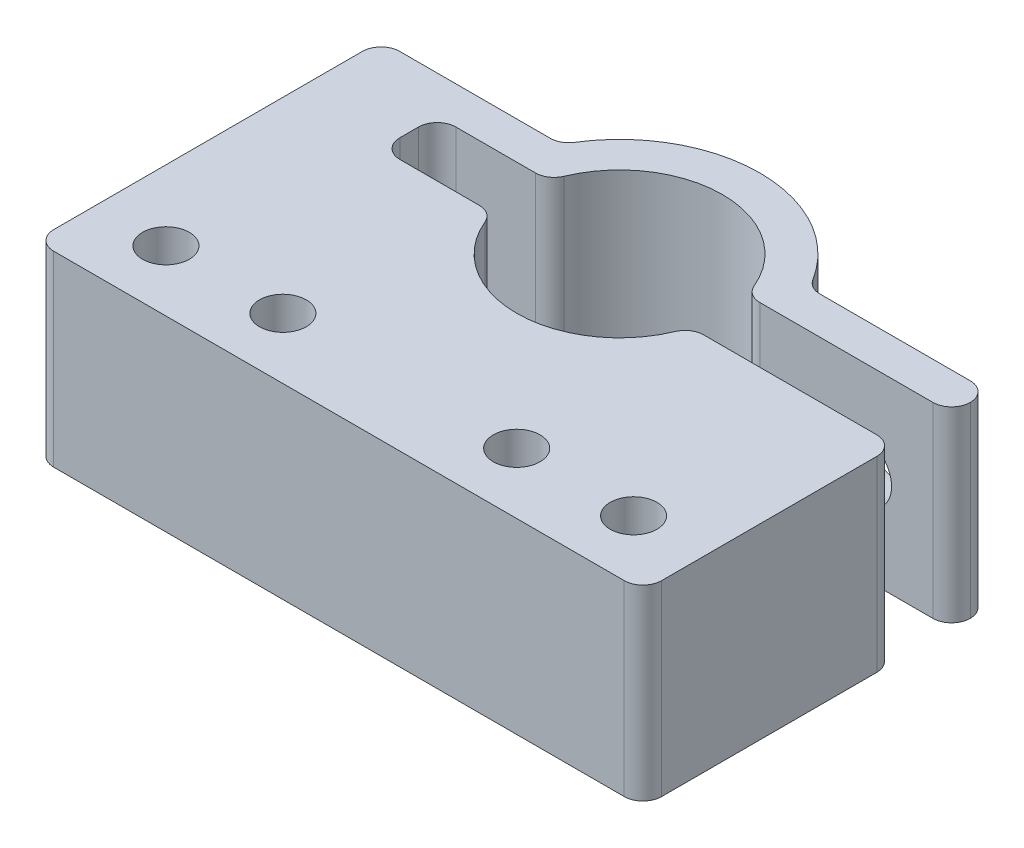
ISO-10303-21;
HEADER;
FILE_DESCRIPTION(('STEP AP214'),'2;1');
FILE_NAME('part.step','',(''),(''),'','','');
FILE_SCHEMA(('AUTOMOTIVE_DESIGN { 1 0 10303 214 1 1 1 1 }'));
ENDSEC;
DATA;
#1=APPLICATION_CONTEXT('core data for automotive mechanical design processes');
#2=APPLICATION_PROTOCOL_DEFINITION('international standard','automotive_design',2000,#1);
#3=PRODUCT_CONTEXT('',#1,'mechanical');
#4=PRODUCT('Part','Part','',(#3));
#5=PRODUCT_RELATED_PRODUCT_CATEGORY('part','',(#4));
#6=PRODUCT_DEFINITION_FORMATION('','',#4);
#7=PRODUCT_DEFINITION_CONTEXT('part definition',#1,'design');
#8=PRODUCT_DEFINITION('design','',#6,#7);
#9=PRODUCT_DEFINITION_SHAPE('','',#8);
#10=(LENGTH_UNIT() NAMED_UNIT(*) SI_UNIT(.MILLI.,.METRE.));
#11=(NAMED_UNIT(*) PLANE_ANGLE_UNIT() SI_UNIT($,.RADIAN.));
#12=(NAMED_UNIT(*) SI_UNIT($,.STERADIAN.) SOLID_ANGLE_UNIT());
#13=UNCERTAINTY_MEASURE_WITH_UNIT(LENGTH_MEASURE(1.E-05),#10,'distance_accuracy_value','');
#14=(GEOMETRIC_REPRESENTATION_CONTEXT(3) GLOBAL_UNCERTAINTY_ASSIGNED_CONTEXT((#13)) GLOBAL_UNIT_ASSIGNED_CONTEXT((#10,
#11,#12)) REPRESENTATION_CONTEXT('',''));
#15=CARTESIAN_POINT('',(0.,0.,0.));
#16=DIRECTION('',(0.,0.,1.));
#17=DIRECTION('',(1.,0.,0.));
#18=AXIS2_PLACEMENT_3D('',#15,#16,#17);
#19=CARTESIAN_POINT('',(0.,20.,0.));
#20=DIRECTION('',(0.,1.,0.));
#21=DIRECTION('',(0.,0.,1.));
#22=AXIS2_PLACEMENT_3D('',#19,#20,#21);
#23=PLANE('',#22);
#24=DIRECTION('',(0.,0.,-1.));
#25=VECTOR('',#24,1.);
#26=CARTESIAN_POINT('',(32.5,20.,-30.));
#27=LINE('',#26,#25);
#28=CARTESIAN_POINT('',(32.5,20.,28.));
#29=VERTEX_POINT('',#28);
#30=CARTESIAN_POINT('',(32.5,20.,5.));
#31=VERTEX_POINT('',#30);
#32=EDGE_CURVE('E305',#29,#31,#27,.T.);
#33=ORIENTED_EDGE('',*,*,#32,.T.);
#34=CARTESIAN_POINT('',(30.5,20.,5.));
#35=DIRECTION('',(0.,1.,0.));
#36=DIRECTION('',(0.,0.,1.));
#37=AXIS2_PLACEMENT_3D('',#34,#35,#36);
#38=CIRCLE('',#37,2.);
#39=CARTESIAN_POINT('',(30.5,20.,3.));
#40=VERTEX_POINT('',#39);
#41=EDGE_CURVE('E372',#31,#40,#38,.T.);
#42=ORIENTED_EDGE('',*,*,#41,.T.);
#43=DIRECTION('',(-1.,0.,0.));
#44=VECTOR('',#43,1.);
#45=CARTESIAN_POINT('',(0.,20.,3.));
#46=LINE('',#45,#44);
#47=CARTESIAN_POINT('',(12.,20.,3.));
#48=VERTEX_POINT('',#47);
#49=EDGE_CURVE('E285',#40,#48,#46,.T.);
#50=ORIENTED_EDGE('',*,*,#49,.T.);
#51=CARTESIAN_POINT('',(12.,20.,5.));
#52=DIRECTION('',(0.,1.,0.));
#53=DIRECTION('',(0.,0.,1.));
#54=AXIS2_PLACEMENT_3D('',#51,#52,#53);
#55=CIRCLE('',#54,2.);
#56=CARTESIAN_POINT('',(10.1538461538461,20.,4.23076923076923));
#57=VERTEX_POINT('',#56);
#58=EDGE_CURVE('E370',#48,#57,#55,.T.);
#59=ORIENTED_EDGE('',*,*,#58,.T.);
#60=CARTESIAN_POINT('',(0.,20.,0.));
#61=DIRECTION('',(0.,1.,0.));
#62=DIRECTION('',(0.,0.,1.));
#63=AXIS2_PLACEMENT_3D('',#60,#61,#62);
#64=CIRCLE('',#63,11.);
#65=CARTESIAN_POINT('',(-10.1538461538462,20.,4.23076923076923));
#66=VERTEX_POINT('',#65);
#67=EDGE_CURVE('E301',#66,#57,#64,.T.);
#68=ORIENTED_EDGE('',*,*,#67,.F.);
#69=CARTESIAN_POINT('',(-12.,20.,4.99999999999999));
#70=DIRECTION('',(0.,1.,0.));
#71=DIRECTION('',(0.,0.,1.));
#72=AXIS2_PLACEMENT_3D('',#69,#70,#71);
#73=CIRCLE('',#72,2.);
#74=CARTESIAN_POINT('',(-12.,20.,3.));
#75=VERTEX_POINT('',#74);
#76=EDGE_CURVE('E368',#66,#75,#73,.T.);
#77=ORIENTED_EDGE('',*,*,#76,.T.);
#78=CARTESIAN_POINT('',(-20.5,20.,2.99999999999999));
#79=VERTEX_POINT('',#78);
#80=EDGE_CURVE('E281',#75,#79,#46,.T.);
#81=ORIENTED_EDGE('',*,*,#80,.T.);
#82=CARTESIAN_POINT('',(-20.5,20.,0.999999999999994));
#83=DIRECTION('',(0.,1.,0.));
#84=DIRECTION('',(0.,0.,1.));
#85=AXIS2_PLACEMENT_3D('',#82,#83,#84);
#86=CIRCLE('',#85,2.);
#87=CARTESIAN_POINT('',(-22.5,20.,0.999999999999994));
#88=VERTEX_POINT('',#87);
#89=EDGE_CURVE('E430',#79,#88,#86,.F.);
#90=ORIENTED_EDGE('',*,*,#89,.T.);
#91=DIRECTION('',(0.,0.,-1.));
#92=VECTOR('',#91,1.);
#93=CARTESIAN_POINT('',(-22.5,20.,0.));
#94=LINE('',#93,#92);
#95=CARTESIAN_POINT('',(-22.5,20.,-0.999999999999995));
#96=VERTEX_POINT('',#95);
#97=EDGE_CURVE('E293',#88,#96,#94,.T.);
#98=ORIENTED_EDGE('',*,*,#97,.T.);
#99=CARTESIAN_POINT('',(-20.5,20.,-0.999999999999995));
#100=DIRECTION('',(0.,1.,0.));
#101=DIRECTION('',(0.,0.,1.));
#102=AXIS2_PLACEMENT_3D('',#99,#100,#101);
#103=CIRCLE('',#102,2.);
#104=CARTESIAN_POINT('',(-20.5,20.,-2.99999999999999));
#105=VERTEX_POINT('',#104);
#106=EDGE_CURVE('E434',#96,#105,#103,.F.);
#107=ORIENTED_EDGE('',*,*,#106,.T.);
#108=DIRECTION('',(1.,0.,0.));
#109=VECTOR('',#108,1.);
#110=CARTESIAN_POINT('',(0.,20.,-3.));
#111=LINE('',#110,#109);
#112=CARTESIAN_POINT('',(-12.,20.,-3.));
#113=VERTEX_POINT('',#112);
#114=EDGE_CURVE('E289',#105,#113,#111,.T.);
#115=ORIENTED_EDGE('',*,*,#114,.T.);
#116=CARTESIAN_POINT('',(-12.,20.,-5.));
#117=DIRECTION('',(0.,1.,0.));
#118=DIRECTION('',(0.,0.,1.));
#119=AXIS2_PLACEMENT_3D('',#116,#117,#118);
#120=CIRCLE('',#119,2.);
#121=CARTESIAN_POINT('',(-10.1538461538462,20.,-4.23076923076923));
#122=VERTEX_POINT('',#121);
#123=EDGE_CURVE('E366',#113,#122,#120,.T.);
#124=ORIENTED_EDGE('',*,*,#123,.T.);
#125=CARTESIAN_POINT('',(10.1538461538461,20.,-4.23076923076923));
#126=VERTEX_POINT('',#125);
#127=EDGE_CURVE('E297',#126,#122,#64,.T.);
#128=ORIENTED_EDGE('',*,*,#127,.F.);
#129=CARTESIAN_POINT('',(12.,20.,-5.));
#130=DIRECTION('',(0.,1.,0.));
#131=DIRECTION('',(0.,0.,1.));
#132=AXIS2_PLACEMENT_3D('',#129,#130,#131);
#133=CIRCLE('',#132,2.);
#134=CARTESIAN_POINT('',(12.,20.,-3.));
#135=VERTEX_POINT('',#134);
#136=EDGE_CURVE('E364',#126,#135,#133,.T.);
#137=ORIENTED_EDGE('',*,*,#136,.T.);
#138=CARTESIAN_POINT('',(30.5,20.,-3.));
#139=VERTEX_POINT('',#138);
#140=EDGE_CURVE('E290',#135,#139,#111,.T.);
#141=ORIENTED_EDGE('',*,*,#140,.T.);
#142=CARTESIAN_POINT('',(30.5,20.,-5.));
#143=DIRECTION('',(0.,1.,0.));
#144=DIRECTION('',(0.,0.,1.));
#145=AXIS2_PLACEMENT_3D('',#142,#143,#144);
#146=CIRCLE('',#145,2.);
#147=CARTESIAN_POINT('',(32.5,20.,-5.));
#148=VERTEX_POINT('',#147);
#149=EDGE_CURVE('E51',#139,#148,#146,.T.);
#150=ORIENTED_EDGE('',*,*,#149,.T.);
#151=CARTESIAN_POINT('',(30.5,20.,-5.));
#152=DIRECTION('',(0.,1.,0.));
#153=DIRECTION('',(0.,0.,1.));
#154=AXIS2_PLACEMENT_3D('',#151,#152,#153);
#155=CIRCLE('',#154,2.);
#156=CARTESIAN_POINT('',(30.5,20.,-7.));
#157=VERTEX_POINT('',#156);
#158=EDGE_CURVE('E361',#148,#157,#155,.T.);
#159=ORIENTED_EDGE('',*,*,#158,.T.);
#160=DIRECTION('',(1.,0.,0.));
#161=VECTOR('',#160,1.);
#162=CARTESIAN_POINT('',(13.2664991614216,20.,-7.));
#163=LINE('',#162,#161);
#164=CARTESIAN_POINT('',(14.422205101856,20.,-7.));
#165=VERTEX_POINT('',#164);
#166=EDGE_CURVE('E241',#165,#157,#163,.T.);
#167=ORIENTED_EDGE('',*,*,#166,.F.);
#168=CARTESIAN_POINT('',(14.422205101856,20.,-9.));
#169=DIRECTION('',(0.,1.,0.));
#170=DIRECTION('',(0.,0.,1.));
#171=AXIS2_PLACEMENT_3D('',#168,#169,#170);
#172=CIRCLE('',#171,2.);
#173=CARTESIAN_POINT('',(12.7254750898729,20.,-7.94117647058823));
#174=VERTEX_POINT('',#173);
#175=EDGE_CURVE('E436',#165,#174,#172,.F.);
#176=ORIENTED_EDGE('',*,*,#175,.T.);
#177=CARTESIAN_POINT('',(0.,20.,0.));
#178=DIRECTION('',(0.,-1.,0.));
#179=DIRECTION('',(0.,0.,-1.));
#180=AXIS2_PLACEMENT_3D('',#177,#178,#179);
#181=CIRCLE('',#180,15.);
#182=CARTESIAN_POINT('',(-12.7254750898729,20.,-7.94117647058823));
#183=VERTEX_POINT('',#182);
#184=EDGE_CURVE('E250',#183,#174,#181,.T.);
#185=ORIENTED_EDGE('',*,*,#184,.F.);
#186=CARTESIAN_POINT('',(-14.422205101856,20.,-9.));
#187=DIRECTION('',(0.,1.,0.));
#188=DIRECTION('',(0.,0.,1.));
#189=AXIS2_PLACEMENT_3D('',#186,#187,#188);
#190=CIRCLE('',#189,2.);
#191=CARTESIAN_POINT('',(-14.422205101856,20.,-7.));
#192=VERTEX_POINT('',#191);
#193=EDGE_CURVE('E44',#183,#192,#190,.F.);
#194=ORIENTED_EDGE('',*,*,#193,.T.);
#195=DIRECTION('',(1.,0.,0.));
#196=VECTOR('',#195,1.);
#197=CARTESIAN_POINT('',(-32.5,20.,-7.));
#198=LINE('',#197,#196);
#199=CARTESIAN_POINT('',(-30.5,20.,-7.));
#200=VERTEX_POINT('',#199);
#201=EDGE_CURVE('E236',#200,#192,#198,.T.);
#202=ORIENTED_EDGE('',*,*,#201,.F.);
#203=CARTESIAN_POINT('',(-30.5,20.,-5.));
#204=DIRECTION('',(0.,1.,0.));
#205=DIRECTION('',(0.,0.,1.));
#206=AXIS2_PLACEMENT_3D('',#203,#204,#205);
#207=CIRCLE('',#206,2.);
#208=CARTESIAN_POINT('',(-32.5,20.,-4.99999999999999));
#209=VERTEX_POINT('',#208);
#210=EDGE_CURVE('E357',#200,#209,#207,.T.);
#211=ORIENTED_EDGE('',*,*,#210,.T.);
#212=DIRECTION('',(0.,0.,1.));
#213=VECTOR('',#212,1.);
#214=CARTESIAN_POINT('',(-32.5,20.,-30.));
#215=LINE('',#214,#213);
#216=CARTESIAN_POINT('',(-32.5,20.,28.));
#217=VERTEX_POINT('',#216);
#218=EDGE_CURVE('E308',#209,#217,#215,.T.);
#219=ORIENTED_EDGE('',*,*,#218,.T.);
#220=CARTESIAN_POINT('',(-30.5,20.,28.));
#221=DIRECTION('',(0.,1.,0.));
#222=DIRECTION('',(0.,0.,1.));
#223=AXIS2_PLACEMENT_3D('',#220,#221,#222);
#224=CIRCLE('',#223,2.);
#225=CARTESIAN_POINT('',(-30.5,20.,30.));
#226=VERTEX_POINT('',#225);
#227=EDGE_CURVE('E355',#217,#226,#224,.T.);
#228=ORIENTED_EDGE('',*,*,#227,.T.);
#229=DIRECTION('',(1.,0.,0.));
#230=VECTOR('',#229,1.);
#231=CARTESIAN_POINT('',(-32.5,20.,30.));
#232=LINE('',#231,#230);
#233=CARTESIAN_POINT('',(30.5,20.,30.));
#234=VERTEX_POINT('',#233);
#235=EDGE_CURVE('E312',#226,#234,#232,.T.);
#236=ORIENTED_EDGE('',*,*,#235,.T.);
#237=CARTESIAN_POINT('',(30.5,20.,28.));
#238=DIRECTION('',(0.,1.,0.));
#239=DIRECTION('',(0.,0.,1.));
#240=AXIS2_PLACEMENT_3D('',#237,#238,#239);
#241=CIRCLE('',#240,2.);
#242=EDGE_CURVE('E359',#234,#29,#241,.T.);
#243=ORIENTED_EDGE('',*,*,#242,.T.);
#244=EDGE_LOOP('',(#33,#42,#50,#59,#68,#77,#81,#90,#98,#107,#115,#124,#128,#137,#141,#150,#159,
#167,#176,#185,#194,#202,#211,#219,#228,#236,#243));
#245=FACE_BOUND('',#244,.T.);
#246=CARTESIAN_POINT('',(-25.,20.,23.5));
#247=DIRECTION('',(0.,1.,0.));
#248=DIRECTION('',(0.,0.,1.));
#249=AXIS2_PLACEMENT_3D('',#246,#247,#248);
#250=CIRCLE('',#249,2.5);
#251=CARTESIAN_POINT('',(-25.,20.,26.));
#252=VERTEX_POINT('',#251);
#253=EDGE_CURVE('E247',#252,#252,#250,.T.);
#254=ORIENTED_EDGE('',*,*,#253,.F.);
#255=EDGE_LOOP('',(#254));
#256=FACE_BOUND('',#255,.T.);
#257=CARTESIAN_POINT('',(-12.5,20.,23.5));
#258=DIRECTION('',(0.,1.,0.));
#259=DIRECTION('',(0.,0.,1.));
#260=AXIS2_PLACEMENT_3D('',#257,#258,#259);
#261=CIRCLE('',#260,2.5);
#262=CARTESIAN_POINT('',(-12.5,20.,26.));
#263=VERTEX_POINT('',#262);
#264=EDGE_CURVE('E260',#263,#263,#261,.T.);
#265=ORIENTED_EDGE('',*,*,#264,.F.);
#266=EDGE_LOOP('',(#265));
#267=FACE_BOUND('',#266,.T.);
#268=CARTESIAN_POINT('',(25.,20.,23.5));
#269=DIRECTION('',(0.,1.,0.));
#270=DIRECTION('',(0.,0.,1.));
#271=AXIS2_PLACEMENT_3D('',#268,#269,#270);
#272=CIRCLE('',#271,2.5);
#273=CARTESIAN_POINT('',(25.,20.,26.));
#274=VERTEX_POINT('',#273);
#275=EDGE_CURVE('E269',#274,#274,#272,.T.);
#276=ORIENTED_EDGE('',*,*,#275,.F.);
#277=EDGE_LOOP('',(#276));
#278=FACE_BOUND('',#277,.T.);
#279=CARTESIAN_POINT('',(12.5,20.,23.5));
#280=DIRECTION('',(0.,1.,0.));
#281=DIRECTION('',(0.,0.,1.));
#282=AXIS2_PLACEMENT_3D('',#279,#280,#281);
#283=CIRCLE('',#282,2.5);
#284=CARTESIAN_POINT('',(12.5,20.,26.));
#285=VERTEX_POINT('',#284);
#286=EDGE_CURVE('E272',#285,#285,#283,.T.);
#287=ORIENTED_EDGE('',*,*,#286,.F.);
#288=EDGE_LOOP('',(#287));
#289=FACE_BOUND('',#288,.T.);
#290=ADVANCED_FACE('F35',(#245,#256,#267,#278,#289),#23,.T.);
#291=CARTESIAN_POINT('',(0.,0.,0.));
#292=DIRECTION('',(0.,1.,0.));
#293=DIRECTION('',(0.,0.,1.));
#294=AXIS2_PLACEMENT_3D('',#291,#292,#293);
#295=PLANE('',#294);
#296=CARTESIAN_POINT('',(-25.,0.,23.5));
#297=DIRECTION('',(0.,1.,0.));
#298=DIRECTION('',(0.,0.,1.));
#299=AXIS2_PLACEMENT_3D('',#296,#297,#298);
#300=CIRCLE('',#299,2.5);
#301=CARTESIAN_POINT('',(-25.,0.,26.));
#302=VERTEX_POINT('',#301);
#303=EDGE_CURVE('E257',#302,#302,#300,.T.);
#304=ORIENTED_EDGE('',*,*,#303,.T.);
#305=EDGE_LOOP('',(#304));
#306=FACE_BOUND('',#305,.T.);
#307=CARTESIAN_POINT('',(-12.5,0.,23.5));
#308=DIRECTION('',(0.,1.,0.));
#309=DIRECTION('',(0.,0.,1.));
#310=AXIS2_PLACEMENT_3D('',#307,#308,#309);
#311=CIRCLE('',#310,2.5);
#312=CARTESIAN_POINT('',(-12.5,0.,26.));
#313=VERTEX_POINT('',#312);
#314=EDGE_CURVE('E263',#313,#313,#311,.T.);
#315=ORIENTED_EDGE('',*,*,#314,.T.);
#316=EDGE_LOOP('',(#315));
#317=FACE_BOUND('',#316,.T.);
#318=CARTESIAN_POINT('',(25.,0.,23.5));
#319=DIRECTION('',(0.,1.,0.));
#320=DIRECTION('',(0.,0.,1.));
#321=AXIS2_PLACEMENT_3D('',#318,#319,#320);
#322=CIRCLE('',#321,2.5);
#323=CARTESIAN_POINT('',(25.,0.,26.));
#324=VERTEX_POINT('',#323);
#325=EDGE_CURVE('E266',#324,#324,#322,.T.);
#326=ORIENTED_EDGE('',*,*,#325,.T.);
#327=EDGE_LOOP('',(#326));
#328=FACE_BOUND('',#327,.T.);
#329=CARTESIAN_POINT('',(12.5,0.,23.5));
#330=DIRECTION('',(0.,1.,0.));
#331=DIRECTION('',(0.,0.,1.));
#332=AXIS2_PLACEMENT_3D('',#329,#330,#331);
#333=CIRCLE('',#332,2.5);
#334=CARTESIAN_POINT('',(12.5,0.,26.));
#335=VERTEX_POINT('',#334);
#336=EDGE_CURVE('E275',#335,#335,#333,.T.);
#337=ORIENTED_EDGE('',*,*,#336,.T.);
#338=EDGE_LOOP('',(#337));
#339=FACE_BOUND('',#338,.T.);
#340=DIRECTION('',(-1.,0.,0.));
#341=VECTOR('',#340,1.);
#342=CARTESIAN_POINT('',(0.,0.,3.));
#343=LINE('',#342,#341);
#344=CARTESIAN_POINT('',(30.5,0.,3.));
#345=VERTEX_POINT('',#344);
#346=CARTESIAN_POINT('',(12.,0.,3.));
#347=VERTEX_POINT('',#346);
#348=EDGE_CURVE('E282',#345,#347,#343,.T.);
#349=ORIENTED_EDGE('',*,*,#348,.F.);
#350=CARTESIAN_POINT('',(30.5,0.,5.));
#351=DIRECTION('',(0.,1.,0.));
#352=DIRECTION('',(0.,0.,1.));
#353=AXIS2_PLACEMENT_3D('',#350,#351,#352);
#354=CIRCLE('',#353,2.);
#355=CARTESIAN_POINT('',(32.5,0.,5.));
#356=VERTEX_POINT('',#355);
#357=EDGE_CURVE('E348',#345,#356,#354,.F.);
#358=ORIENTED_EDGE('',*,*,#357,.T.);
#359=DIRECTION('',(0.,0.,-1.));
#360=VECTOR('',#359,1.);
#361=CARTESIAN_POINT('',(32.5,0.,-30.));
#362=LINE('',#361,#360);
#363=CARTESIAN_POINT('',(32.5,0.,28.));
#364=VERTEX_POINT('',#363);
#365=EDGE_CURVE('E300',#364,#356,#362,.T.);
#366=ORIENTED_EDGE('',*,*,#365,.F.);
#367=CARTESIAN_POINT('',(30.5,0.,28.));
#368=DIRECTION('',(0.,1.,0.));
#369=DIRECTION('',(0.,0.,1.));
#370=AXIS2_PLACEMENT_3D('',#367,#368,#369);
#371=CIRCLE('',#370,2.);
#372=CARTESIAN_POINT('',(30.5,0.,30.));
#373=VERTEX_POINT('',#372);
#374=EDGE_CURVE('E334',#364,#373,#371,.F.);
#375=ORIENTED_EDGE('',*,*,#374,.T.);
#376=DIRECTION('',(1.,0.,0.));
#377=VECTOR('',#376,1.);
#378=CARTESIAN_POINT('',(-32.5,0.,30.));
#379=LINE('',#378,#377);
#380=CARTESIAN_POINT('',(-30.5,0.,30.));
#381=VERTEX_POINT('',#380);
#382=EDGE_CURVE('E309',#381,#373,#379,.T.);
#383=ORIENTED_EDGE('',*,*,#382,.F.);
#384=CARTESIAN_POINT('',(-30.5,0.,28.));
#385=DIRECTION('',(0.,1.,0.));
#386=DIRECTION('',(0.,0.,1.));
#387=AXIS2_PLACEMENT_3D('',#384,#385,#386);
#388=CIRCLE('',#387,2.);
#389=CARTESIAN_POINT('',(-32.5,0.,28.));
#390=VERTEX_POINT('',#389);
#391=EDGE_CURVE('E330',#381,#390,#388,.F.);
#392=ORIENTED_EDGE('',*,*,#391,.T.);
#393=DIRECTION('',(0.,0.,1.));
#394=VECTOR('',#393,1.);
#395=CARTESIAN_POINT('',(-32.5,0.,-30.));
#396=LINE('',#395,#394);
#397=CARTESIAN_POINT('',(-32.5,0.,-4.99999999999999));
#398=VERTEX_POINT('',#397);
#399=EDGE_CURVE('E318',#398,#390,#396,.T.);
#400=ORIENTED_EDGE('',*,*,#399,.F.);
#401=CARTESIAN_POINT('',(-30.5,0.,-5.));
#402=DIRECTION('',(0.,1.,0.));
#403=DIRECTION('',(0.,0.,1.));
#404=AXIS2_PLACEMENT_3D('',#401,#402,#403);
#405=CIRCLE('',#404,2.);
#406=CARTESIAN_POINT('',(-30.5,0.,-7.));
#407=VERTEX_POINT('',#406);
#408=EDGE_CURVE('E332',#398,#407,#405,.F.);
#409=ORIENTED_EDGE('',*,*,#408,.T.);
#410=DIRECTION('',(1.,0.,0.));
#411=VECTOR('',#410,1.);
#412=CARTESIAN_POINT('',(-32.5,0.,-7.));
#413=LINE('',#412,#411);
#414=CARTESIAN_POINT('',(-14.422205101856,0.,-7.));
#415=VERTEX_POINT('',#414);
#416=EDGE_CURVE('E237',#407,#415,#413,.T.);
#417=ORIENTED_EDGE('',*,*,#416,.T.);
#418=CARTESIAN_POINT('',(-14.422205101856,0.,-9.));
#419=DIRECTION('',(0.,1.,0.));
#420=DIRECTION('',(0.,0.,1.));
#421=AXIS2_PLACEMENT_3D('',#418,#419,#420);
#422=CIRCLE('',#421,2.);
#423=CARTESIAN_POINT('',(-12.7254750898729,0.,-7.94117647058823));
#424=VERTEX_POINT('',#423);
#425=EDGE_CURVE('E11',#415,#424,#422,.T.);
#426=ORIENTED_EDGE('',*,*,#425,.T.);
#427=CARTESIAN_POINT('',(0.,0.,0.));
#428=DIRECTION('',(0.,-1.,0.));
#429=DIRECTION('',(0.,0.,-1.));
#430=AXIS2_PLACEMENT_3D('',#427,#428,#429);
#431=CIRCLE('',#430,15.);
#432=CARTESIAN_POINT('',(12.7254750898729,0.,-7.94117647058823));
#433=VERTEX_POINT('',#432);
#434=EDGE_CURVE('E240',#424,#433,#431,.T.);
#435=ORIENTED_EDGE('',*,*,#434,.T.);
#436=CARTESIAN_POINT('',(14.422205101856,0.,-9.));
#437=DIRECTION('',(0.,1.,0.));
#438=DIRECTION('',(0.,0.,1.));
#439=AXIS2_PLACEMENT_3D('',#436,#437,#438);
#440=CIRCLE('',#439,2.);
#441=CARTESIAN_POINT('',(14.422205101856,0.,-7.));
#442=VERTEX_POINT('',#441);
#443=EDGE_CURVE('E438',#433,#442,#440,.T.);
#444=ORIENTED_EDGE('',*,*,#443,.T.);
#445=DIRECTION('',(1.,0.,0.));
#446=VECTOR('',#445,1.);
#447=CARTESIAN_POINT('',(13.2664991614216,0.,-7.));
#448=LINE('',#447,#446);
#449=CARTESIAN_POINT('',(30.5,0.,-7.));
#450=VERTEX_POINT('',#449);
#451=EDGE_CURVE('E244',#442,#450,#448,.T.);
#452=ORIENTED_EDGE('',*,*,#451,.T.);
#453=CARTESIAN_POINT('',(30.5,0.,-5.));
#454=DIRECTION('',(0.,1.,0.));
#455=DIRECTION('',(0.,0.,1.));
#456=AXIS2_PLACEMENT_3D('',#453,#454,#455);
#457=CIRCLE('',#456,2.);
#458=CARTESIAN_POINT('',(32.5,0.,-5.));
#459=VERTEX_POINT('',#458);
#460=EDGE_CURVE('E336',#450,#459,#457,.F.);
#461=ORIENTED_EDGE('',*,*,#460,.T.);
#462=CARTESIAN_POINT('',(30.5,0.,-5.));
#463=DIRECTION('',(0.,1.,0.));
#464=DIRECTION('',(0.,0.,1.));
#465=AXIS2_PLACEMENT_3D('',#462,#463,#464);
#466=CIRCLE('',#465,2.);
#467=CARTESIAN_POINT('',(30.5,0.,-3.));
#468=VERTEX_POINT('',#467);
#469=EDGE_CURVE('E338',#459,#468,#466,.F.);
#470=ORIENTED_EDGE('',*,*,#469,.T.);
#471=DIRECTION('',(1.,0.,0.));
#472=VECTOR('',#471,1.);
#473=CARTESIAN_POINT('',(0.,0.,-3.));
#474=LINE('',#473,#472);
#475=CARTESIAN_POINT('',(12.,0.,-3.));
#476=VERTEX_POINT('',#475);
#477=EDGE_CURVE('E291',#476,#468,#474,.T.);
#478=ORIENTED_EDGE('',*,*,#477,.F.);
#479=CARTESIAN_POINT('',(12.,0.,-5.));
#480=DIRECTION('',(0.,1.,0.));
#481=DIRECTION('',(0.,0.,1.));
#482=AXIS2_PLACEMENT_3D('',#479,#480,#481);
#483=CIRCLE('',#482,2.);
#484=CARTESIAN_POINT('',(10.1538461538461,0.,-4.23076923076923));
#485=VERTEX_POINT('',#484);
#486=EDGE_CURVE('E340',#476,#485,#483,.F.);
#487=ORIENTED_EDGE('',*,*,#486,.T.);
#488=CARTESIAN_POINT('',(0.,0.,0.));
#489=DIRECTION('',(0.,1.,0.));
#490=DIRECTION('',(0.,0.,1.));
#491=AXIS2_PLACEMENT_3D('',#488,#489,#490);
#492=CIRCLE('',#491,11.);
#493=CARTESIAN_POINT('',(-10.1538461538462,0.,-4.23076923076923));
#494=VERTEX_POINT('',#493);
#495=EDGE_CURVE('E304',#485,#494,#492,.T.);
#496=ORIENTED_EDGE('',*,*,#495,.T.);
#497=CARTESIAN_POINT('',(-12.,0.,-5.));
#498=DIRECTION('',(0.,1.,0.));
#499=DIRECTION('',(0.,0.,1.));
#500=AXIS2_PLACEMENT_3D('',#497,#498,#499);
#501=CIRCLE('',#500,2.);
#502=CARTESIAN_POINT('',(-12.,0.,-3.));
#503=VERTEX_POINT('',#502);
#504=EDGE_CURVE('E342',#494,#503,#501,.F.);
#505=ORIENTED_EDGE('',*,*,#504,.T.);
#506=CARTESIAN_POINT('',(-20.5,0.,-2.99999999999999));
#507=VERTEX_POINT('',#506);
#508=EDGE_CURVE('E286',#507,#503,#474,.T.);
#509=ORIENTED_EDGE('',*,*,#508,.F.);
#510=CARTESIAN_POINT('',(-20.5,0.,-0.999999999999995));
#511=DIRECTION('',(0.,1.,0.));
#512=DIRECTION('',(0.,0.,1.));
#513=AXIS2_PLACEMENT_3D('',#510,#511,#512);
#514=CIRCLE('',#513,2.);
#515=CARTESIAN_POINT('',(-22.5,0.,-0.999999999999995));
#516=VERTEX_POINT('',#515);
#517=EDGE_CURVE('E432',#507,#516,#514,.T.);
#518=ORIENTED_EDGE('',*,*,#517,.T.);
#519=DIRECTION('',(0.,0.,-1.));
#520=VECTOR('',#519,1.);
#521=CARTESIAN_POINT('',(-22.5,0.,0.));
#522=LINE('',#521,#520);
#523=CARTESIAN_POINT('',(-22.5,0.,0.999999999999994));
#524=VERTEX_POINT('',#523);
#525=EDGE_CURVE('E315',#524,#516,#522,.T.);
#526=ORIENTED_EDGE('',*,*,#525,.F.);
#527=CARTESIAN_POINT('',(-20.5,0.,0.999999999999994));
#528=DIRECTION('',(0.,1.,0.));
#529=DIRECTION('',(0.,0.,1.));
#530=AXIS2_PLACEMENT_3D('',#527,#528,#529);
#531=CIRCLE('',#530,2.);
#532=CARTESIAN_POINT('',(-20.5,0.,2.99999999999999));
#533=VERTEX_POINT('',#532);
#534=EDGE_CURVE('E428',#524,#533,#531,.T.);
#535=ORIENTED_EDGE('',*,*,#534,.T.);
#536=CARTESIAN_POINT('',(-12.,0.,3.));
#537=VERTEX_POINT('',#536);
#538=EDGE_CURVE('E278',#537,#533,#343,.T.);
#539=ORIENTED_EDGE('',*,*,#538,.F.);
#540=CARTESIAN_POINT('',(-12.,0.,4.99999999999999));
#541=DIRECTION('',(0.,1.,0.));
#542=DIRECTION('',(0.,0.,1.));
#543=AXIS2_PLACEMENT_3D('',#540,#541,#542);
#544=CIRCLE('',#543,2.);
#545=CARTESIAN_POINT('',(-10.1538461538462,0.,4.23076923076923));
#546=VERTEX_POINT('',#545);
#547=EDGE_CURVE('E344',#537,#546,#544,.F.);
#548=ORIENTED_EDGE('',*,*,#547,.T.);
#549=CARTESIAN_POINT('',(10.1538461538461,0.,4.23076923076923));
#550=VERTEX_POINT('',#549);
#551=EDGE_CURVE('E296',#546,#550,#492,.T.);
#552=ORIENTED_EDGE('',*,*,#551,.T.);
#553=CARTESIAN_POINT('',(12.,0.,5.));
#554=DIRECTION('',(0.,1.,0.));
#555=DIRECTION('',(0.,0.,1.));
#556=AXIS2_PLACEMENT_3D('',#553,#554,#555);
#557=CIRCLE('',#556,2.);
#558=EDGE_CURVE('E346',#550,#347,#557,.F.);
#559=ORIENTED_EDGE('',*,*,#558,.T.);
#560=EDGE_LOOP('',(#349,#358,#366,#375,#383,#392,#400,#409,#417,#426,#435,#444,#452,#461,#470,
#478,#487,#496,#505,#509,#518,#526,#535,#539,#548,#552,#559));
#561=FACE_BOUND('',#560,.T.);
#562=ADVANCED_FACE('F455',(#306,#317,#328,#339,#561),#295,.F.);
#563=CARTESIAN_POINT('',(32.5,20.,-30.));
#564=DIRECTION('',(-1.,0.,0.));
#565=DIRECTION('',(0.,0.,1.));
#566=AXIS2_PLACEMENT_3D('',#563,#564,#565);
#567=PLANE('',#566);
#568=ORIENTED_EDGE('',*,*,#365,.T.);
#569=DIRECTION('',(0.,-1.,0.));
#570=VECTOR('',#569,1.);
#571=CARTESIAN_POINT('',(32.5,20.,5.));
#572=LINE('',#571,#570);
#573=EDGE_CURVE('E353',#356,#31,#572,.F.);
#574=ORIENTED_EDGE('',*,*,#573,.T.);
#575=ORIENTED_EDGE('',*,*,#32,.F.);
#576=DIRECTION('',(0.,-1.,0.));
#577=VECTOR('',#576,1.);
#578=CARTESIAN_POINT('',(32.5,20.,28.));
#579=LINE('',#578,#577);
#580=EDGE_CURVE('E350',#29,#364,#579,.T.);
#581=ORIENTED_EDGE('',*,*,#580,.T.);
#582=EDGE_LOOP('',(#568,#574,#575,#581));
#583=FACE_BOUND('',#582,.T.);
#584=ADVANCED_FACE('F496',(#583),#567,.F.);
#585=CARTESIAN_POINT('',(0.,20.,0.));
#586=DIRECTION('',(0.,-1.,0.));
#587=DIRECTION('',(0.,0.,-1.));
#588=AXIS2_PLACEMENT_3D('',#585,#586,#587);
#589=CYLINDRICAL_SURFACE('',#588,11.);
#590=ORIENTED_EDGE('',*,*,#127,.T.);
#591=DIRECTION('',(0.,-1.,0.));
#592=VECTOR('',#591,1.);
#593=CARTESIAN_POINT('',(-10.1538461538462,20.,-4.23076923076923));
#594=LINE('',#593,#592);
#595=EDGE_CURVE('E397',#122,#494,#594,.T.);
#596=ORIENTED_EDGE('',*,*,#595,.T.);
#597=ORIENTED_EDGE('',*,*,#495,.F.);
#598=DIRECTION('',(0.,-1.,0.));
#599=VECTOR('',#598,1.);
#600=CARTESIAN_POINT('',(10.1538461538461,20.,-4.23076923076923));
#601=LINE('',#600,#599);
#602=EDGE_CURVE('E394',#485,#126,#601,.F.);
#603=ORIENTED_EDGE('',*,*,#602,.T.);
#604=EDGE_LOOP('',(#590,#596,#597,#603));
#605=FACE_BOUND('',#604,.T.);
#606=ADVANCED_FACE('F500',(#605),#589,.F.);
#607=ORIENTED_EDGE('',*,*,#67,.T.);
#608=DIRECTION('',(0.,-1.,0.));
#609=VECTOR('',#608,1.);
#610=CARTESIAN_POINT('',(10.1538461538461,20.,4.23076923076923));
#611=LINE('',#610,#609);
#612=EDGE_CURVE('E377',#57,#550,#611,.T.);
#613=ORIENTED_EDGE('',*,*,#612,.T.);
#614=ORIENTED_EDGE('',*,*,#551,.F.);
#615=DIRECTION('',(0.,-1.,0.));
#616=VECTOR('',#615,1.);
#617=CARTESIAN_POINT('',(-10.1538461538462,20.,4.23076923076923));
#618=LINE('',#617,#616);
#619=EDGE_CURVE('E374',#546,#66,#618,.F.);
#620=ORIENTED_EDGE('',*,*,#619,.T.);
#621=EDGE_LOOP('',(#607,#613,#614,#620));
#622=FACE_BOUND('',#621,.T.);
#623=ADVANCED_FACE('F511',(#622),#589,.F.);
#624=CARTESIAN_POINT('',(-32.5,20.,-30.));
#625=DIRECTION('',(1.,0.,0.));
#626=DIRECTION('',(0.,0.,-1.));
#627=AXIS2_PLACEMENT_3D('',#624,#625,#626);
#628=PLANE('',#627);
#629=ORIENTED_EDGE('',*,*,#218,.F.);
#630=DIRECTION('',(0.,1.,0.));
#631=VECTOR('',#630,1.);
#632=CARTESIAN_POINT('',(-32.5,20.,-4.99999999999999));
#633=LINE('',#632,#631);
#634=EDGE_CURVE('E426',#209,#398,#633,.F.);
#635=ORIENTED_EDGE('',*,*,#634,.T.);
#636=ORIENTED_EDGE('',*,*,#399,.T.);
#637=DIRECTION('',(0.,-1.,0.));
#638=VECTOR('',#637,1.);
#639=CARTESIAN_POINT('',(-32.5,20.,28.));
#640=LINE('',#639,#638);
#641=EDGE_CURVE('E424',#390,#217,#640,.F.);
#642=ORIENTED_EDGE('',*,*,#641,.T.);
#643=EDGE_LOOP('',(#629,#635,#636,#642));
#644=FACE_BOUND('',#643,.T.);
#645=ADVANCED_FACE('F507',(#644),#628,.F.);
#646=CARTESIAN_POINT('',(-32.5,20.,30.));
#647=DIRECTION('',(0.,0.,-1.));
#648=DIRECTION('',(-1.,0.,0.));
#649=AXIS2_PLACEMENT_3D('',#646,#647,#648);
#650=PLANE('',#649);
#651=ORIENTED_EDGE('',*,*,#382,.T.);
#652=DIRECTION('',(0.,-1.,0.));
#653=VECTOR('',#652,1.);
#654=CARTESIAN_POINT('',(30.5,20.,30.));
#655=LINE('',#654,#653);
#656=EDGE_CURVE('E422',#373,#234,#655,.F.);
#657=ORIENTED_EDGE('',*,*,#656,.T.);
#658=ORIENTED_EDGE('',*,*,#235,.F.);
#659=DIRECTION('',(0.,-1.,0.));
#660=VECTOR('',#659,1.);
#661=CARTESIAN_POINT('',(-30.5,20.,30.));
#662=LINE('',#661,#660);
#663=EDGE_CURVE('E419',#226,#381,#662,.T.);
#664=ORIENTED_EDGE('',*,*,#663,.T.);
#665=EDGE_LOOP('',(#651,#657,#658,#664));
#666=FACE_BOUND('',#665,.T.);
#667=ADVANCED_FACE('F503',(#666),#650,.F.);
#668=CARTESIAN_POINT('',(32.5,133.364732170107,-3.));
#669=DIRECTION('',(0.,0.,1.));
#670=DIRECTION('',(1.,0.,0.));
#671=AXIS2_PLACEMENT_3D('',#668,#669,#670);
#672=PLANE('',#671);
#673=ORIENTED_EDGE('',*,*,#114,.F.);
#674=DIRECTION('',(0.,-1.,0.));
#675=VECTOR('',#674,1.);
#676=CARTESIAN_POINT('',(-20.5,0.,-2.99999999999999));
#677=LINE('',#676,#675);
#678=EDGE_CURVE('E391',#105,#507,#677,.T.);
#679=ORIENTED_EDGE('',*,*,#678,.T.);
#680=ORIENTED_EDGE('',*,*,#508,.T.);
#681=DIRECTION('',(0.,-1.,0.));
#682=VECTOR('',#681,1.);
#683=CARTESIAN_POINT('',(-12.,133.364732170107,-3.));
#684=LINE('',#683,#682);
#685=EDGE_CURVE('E389',#503,#113,#684,.F.);
#686=ORIENTED_EDGE('',*,*,#685,.T.);
#687=EDGE_LOOP('',(#673,#679,#680,#686));
#688=FACE_BOUND('',#687,.T.);
#689=ADVANCED_FACE('F506',(#688),#672,.T.);
#690=CARTESIAN_POINT('',(-22.5,133.364732170107,2.99999999999999));
#691=DIRECTION('',(0.,0.,-1.));
#692=DIRECTION('',(-1.,0.,0.));
#693=AXIS2_PLACEMENT_3D('',#690,#691,#692);
#694=PLANE('',#693);
#695=ORIENTED_EDGE('',*,*,#80,.F.);
#696=DIRECTION('',(0.,-1.,0.));
#697=VECTOR('',#696,1.);
#698=CARTESIAN_POINT('',(-12.,133.364732170107,3.));
#699=LINE('',#698,#697);
#700=EDGE_CURVE('E382',#75,#537,#699,.T.);
#701=ORIENTED_EDGE('',*,*,#700,.T.);
#702=ORIENTED_EDGE('',*,*,#538,.T.);
#703=DIRECTION('',(0.,-1.,0.));
#704=VECTOR('',#703,1.);
#705=CARTESIAN_POINT('',(-20.5,20.,2.99999999999999));
#706=LINE('',#705,#704);
#707=EDGE_CURVE('E380',#533,#79,#706,.F.);
#708=ORIENTED_EDGE('',*,*,#707,.T.);
#709=EDGE_LOOP('',(#695,#701,#702,#708));
#710=FACE_BOUND('',#709,.T.);
#711=ADVANCED_FACE('F758',(#710),#694,.T.);
#712=CARTESIAN_POINT('',(-22.5,133.364732170107,-2.99999999999999));
#713=DIRECTION('',(1.,0.,0.));
#714=DIRECTION('',(0.,0.,-1.));
#715=AXIS2_PLACEMENT_3D('',#712,#713,#714);
#716=PLANE('',#715);
#717=ORIENTED_EDGE('',*,*,#97,.F.);
#718=DIRECTION('',(0.,-1.,0.));
#719=VECTOR('',#718,1.);
#720=CARTESIAN_POINT('',(-22.5,0.,0.999999999999994));
#721=LINE('',#720,#719);
#722=EDGE_CURVE('E386',#88,#524,#721,.T.);
#723=ORIENTED_EDGE('',*,*,#722,.T.);
#724=ORIENTED_EDGE('',*,*,#525,.T.);
#725=DIRECTION('',(0.,-1.,0.));
#726=VECTOR('',#725,1.);
#727=CARTESIAN_POINT('',(-22.5,20.,-0.999999999999995));
#728=LINE('',#727,#726);
#729=EDGE_CURVE('E384',#516,#96,#728,.F.);
#730=ORIENTED_EDGE('',*,*,#729,.T.);
#731=EDGE_LOOP('',(#717,#723,#724,#730));
#732=FACE_BOUND('',#731,.T.);
#733=ADVANCED_FACE('F755',(#732),#716,.T.);
#734=CARTESIAN_POINT('',(22.8832495807108,10.,3.));
#735=DIRECTION('',(0.,0.,-1.));
#736=DIRECTION('',(-1.,0.,0.));
#737=AXIS2_PLACEMENT_3D('',#734,#735,#736);
#738=CIRCLE('',#737,2.49999999999999);
#739=CARTESIAN_POINT('',(20.3832495807108,10.,3.));
#740=VERTEX_POINT('',#739);
#741=EDGE_CURVE('E226',#740,#740,#738,.T.);
#742=ORIENTED_EDGE('',*,*,#741,.F.);
#743=EDGE_LOOP('',(#742));
#744=FACE_BOUND('',#743,.T.);
#745=ORIENTED_EDGE('',*,*,#49,.F.);
#746=DIRECTION('',(0.,-1.,0.));
#747=VECTOR('',#746,1.);
#748=CARTESIAN_POINT('',(30.5,0.,3.));
#749=LINE('',#748,#747);
#750=EDGE_CURVE('E327',#40,#345,#749,.T.);
#751=ORIENTED_EDGE('',*,*,#750,.T.);
#752=ORIENTED_EDGE('',*,*,#348,.T.);
#753=DIRECTION('',(0.,-1.,0.));
#754=VECTOR('',#753,1.);
#755=CARTESIAN_POINT('',(12.,133.364732170107,3.));
#756=LINE('',#755,#754);
#757=EDGE_CURVE('E325',#347,#48,#756,.F.);
#758=ORIENTED_EDGE('',*,*,#757,.T.);
#759=EDGE_LOOP('',(#745,#751,#752,#758));
#760=FACE_BOUND('',#759,.T.);
#761=ADVANCED_FACE('F560',(#744,#760),#694,.T.);
#762=CARTESIAN_POINT('',(22.8832495807108,10.,-3.));
#763=DIRECTION('',(0.,0.,1.));
#764=DIRECTION('',(1.,0.,0.));
#765=AXIS2_PLACEMENT_3D('',#762,#763,#764);
#766=CIRCLE('',#765,3.2);
#767=CARTESIAN_POINT('',(26.0832495807108,10.,-3.));
#768=VERTEX_POINT('',#767);
#769=EDGE_CURVE('E229',#768,#768,#766,.T.);
#770=ORIENTED_EDGE('',*,*,#769,.F.);
#771=EDGE_LOOP('',(#770));
#772=FACE_BOUND('',#771,.T.);
#773=ORIENTED_EDGE('',*,*,#140,.F.);
#774=DIRECTION('',(0.,-1.,0.));
#775=VECTOR('',#774,1.);
#776=CARTESIAN_POINT('',(12.,133.364732170107,-3.));
#777=LINE('',#776,#775);
#778=EDGE_CURVE('E402',#135,#476,#777,.T.);
#779=ORIENTED_EDGE('',*,*,#778,.T.);
#780=ORIENTED_EDGE('',*,*,#477,.T.);
#781=DIRECTION('',(0.,-1.,0.));
#782=VECTOR('',#781,1.);
#783=CARTESIAN_POINT('',(30.5,20.,-3.));
#784=LINE('',#783,#782);
#785=EDGE_CURVE('E400',#468,#139,#784,.F.);
#786=ORIENTED_EDGE('',*,*,#785,.T.);
#787=EDGE_LOOP('',(#773,#779,#780,#786));
#788=FACE_BOUND('',#787,.T.);
#789=ADVANCED_FACE('F478',(#772,#788),#672,.T.);
#790=CARTESIAN_POINT('',(12.5,20.,23.5));
#791=DIRECTION('',(0.,1.,0.));
#792=DIRECTION('',(0.,0.,1.));
#793=AXIS2_PLACEMENT_3D('',#790,#791,#792);
#794=CYLINDRICAL_SURFACE('',#793,2.5);
#795=ORIENTED_EDGE('',*,*,#336,.F.);
#796=EDGE_LOOP('',(#795));
#797=FACE_BOUND('',#796,.T.);
#798=ORIENTED_EDGE('',*,*,#286,.T.);
#799=EDGE_LOOP('',(#798));
#800=FACE_BOUND('',#799,.T.);
#801=ADVANCED_FACE('F732',(#797,#800),#794,.F.);
#802=CARTESIAN_POINT('',(25.,20.,23.5));
#803=DIRECTION('',(0.,1.,0.));
#804=DIRECTION('',(0.,0.,1.));
#805=AXIS2_PLACEMENT_3D('',#802,#803,#804);
#806=CYLINDRICAL_SURFACE('',#805,2.5);
#807=ORIENTED_EDGE('',*,*,#325,.F.);
#808=EDGE_LOOP('',(#807));
#809=FACE_BOUND('',#808,.T.);
#810=ORIENTED_EDGE('',*,*,#275,.T.);
#811=EDGE_LOOP('',(#810));
#812=FACE_BOUND('',#811,.T.);
#813=ADVANCED_FACE('F723',(#809,#812),#806,.F.);
#814=CARTESIAN_POINT('',(-12.5,20.,23.5));
#815=DIRECTION('',(0.,1.,0.));
#816=DIRECTION('',(0.,0.,1.));
#817=AXIS2_PLACEMENT_3D('',#814,#815,#816);
#818=CYLINDRICAL_SURFACE('',#817,2.5);
#819=ORIENTED_EDGE('',*,*,#314,.F.);
#820=EDGE_LOOP('',(#819));
#821=FACE_BOUND('',#820,.T.);
#822=ORIENTED_EDGE('',*,*,#264,.T.);
#823=EDGE_LOOP('',(#822));
#824=FACE_BOUND('',#823,.T.);
#825=ADVANCED_FACE('F714',(#821,#824),#818,.F.);
#826=CARTESIAN_POINT('',(-25.,20.,23.5));
#827=DIRECTION('',(0.,1.,0.));
#828=DIRECTION('',(0.,0.,1.));
#829=AXIS2_PLACEMENT_3D('',#826,#827,#828);
#830=CYLINDRICAL_SURFACE('',#829,2.5);
#831=ORIENTED_EDGE('',*,*,#303,.F.);
#832=EDGE_LOOP('',(#831));
#833=FACE_BOUND('',#832,.T.);
#834=ORIENTED_EDGE('',*,*,#253,.T.);
#835=EDGE_LOOP('',(#834));
#836=FACE_BOUND('',#835,.T.);
#837=ADVANCED_FACE('F705',(#833,#836),#830,.F.);
#838=CARTESIAN_POINT('',(13.2664991614216,0.,-7.));
#839=DIRECTION('',(0.,0.,1.));
#840=DIRECTION('',(1.,0.,0.));
#841=AXIS2_PLACEMENT_3D('',#838,#839,#840);
#842=PLANE('',#841);
#843=CARTESIAN_POINT('',(22.8832495807108,10.,-7.));
#844=DIRECTION('',(0.,0.,-1.));
#845=DIRECTION('',(-1.,0.,0.));
#846=AXIS2_PLACEMENT_3D('',#843,#844,#845);
#847=CIRCLE('',#846,3.2);
#848=CARTESIAN_POINT('',(19.6832495807108,10.,-7.));
#849=VERTEX_POINT('',#848);
#850=EDGE_CURVE('E225',#849,#849,#847,.T.);
#851=ORIENTED_EDGE('',*,*,#850,.F.);
#852=EDGE_LOOP('',(#851));
#853=FACE_BOUND('',#852,.T.);
#854=ORIENTED_EDGE('',*,*,#451,.F.);
#855=DIRECTION('',(0.,-1.,0.));
#856=VECTOR('',#855,1.);
#857=CARTESIAN_POINT('',(14.422205101856,20.,-7.));
#858=LINE('',#857,#856);
#859=EDGE_CURVE('E406',#442,#165,#858,.F.);
#860=ORIENTED_EDGE('',*,*,#859,.T.);
#861=ORIENTED_EDGE('',*,*,#166,.T.);
#862=DIRECTION('',(0.,1.,0.));
#863=VECTOR('',#862,1.);
#864=CARTESIAN_POINT('',(30.5,0.,-7.));
#865=LINE('',#864,#863);
#866=EDGE_CURVE('E404',#157,#450,#865,.F.);
#867=ORIENTED_EDGE('',*,*,#866,.T.);
#868=EDGE_LOOP('',(#854,#860,#861,#867));
#869=FACE_BOUND('',#868,.T.);
#870=ADVANCED_FACE('F466',(#853,#869),#842,.F.);
#871=CARTESIAN_POINT('',(0.,0.,0.));
#872=DIRECTION('',(0.,1.,0.));
#873=DIRECTION('',(0.,0.,1.));
#874=AXIS2_PLACEMENT_3D('',#871,#872,#873);
#875=CYLINDRICAL_SURFACE('',#874,15.);
#876=ORIENTED_EDGE('',*,*,#184,.T.);
#877=DIRECTION('',(0.,1.,0.));
#878=VECTOR('',#877,1.);
#879=CARTESIAN_POINT('',(12.7254750898729,0.,-7.94117647058823));
#880=LINE('',#879,#878);
#881=EDGE_CURVE('E412',#174,#433,#880,.F.);
#882=ORIENTED_EDGE('',*,*,#881,.T.);
#883=ORIENTED_EDGE('',*,*,#434,.F.);
#884=DIRECTION('',(0.,1.,0.));
#885=VECTOR('',#884,1.);
#886=CARTESIAN_POINT('',(-12.7254750898729,0.,-7.94117647058823));
#887=LINE('',#886,#885);
#888=EDGE_CURVE('E409',#424,#183,#887,.T.);
#889=ORIENTED_EDGE('',*,*,#888,.T.);
#890=EDGE_LOOP('',(#876,#882,#883,#889));
#891=FACE_BOUND('',#890,.T.);
#892=ADVANCED_FACE('F458',(#891),#875,.T.);
#893=CARTESIAN_POINT('',(-32.5,0.,-7.));
#894=DIRECTION('',(0.,0.,1.));
#895=DIRECTION('',(1.,0.,0.));
#896=AXIS2_PLACEMENT_3D('',#893,#894,#895);
#897=PLANE('',#896);
#898=ORIENTED_EDGE('',*,*,#201,.T.);
#899=DIRECTION('',(0.,-1.,0.));
#900=VECTOR('',#899,1.);
#901=CARTESIAN_POINT('',(-14.422205101856,0.,-7.));
#902=LINE('',#901,#900);
#903=EDGE_CURVE('E417',#192,#415,#902,.T.);
#904=ORIENTED_EDGE('',*,*,#903,.T.);
#905=ORIENTED_EDGE('',*,*,#416,.F.);
#906=DIRECTION('',(0.,1.,0.));
#907=VECTOR('',#906,1.);
#908=CARTESIAN_POINT('',(-30.5,0.,-7.));
#909=LINE('',#908,#907);
#910=EDGE_CURVE('E414',#407,#200,#909,.T.);
#911=ORIENTED_EDGE('',*,*,#910,.T.);
#912=EDGE_LOOP('',(#898,#904,#905,#911));
#913=FACE_BOUND('',#912,.T.);
#914=ADVANCED_FACE('F447',(#913),#897,.F.);
#915=CARTESIAN_POINT('',(22.8832495807108,10.,-7.));
#916=DIRECTION('',(0.,0.,-1.));
#917=DIRECTION('',(-1.,0.,0.));
#918=AXIS2_PLACEMENT_3D('',#915,#916,#917);
#919=CYLINDRICAL_SURFACE('',#918,3.2);
#920=ORIENTED_EDGE('',*,*,#850,.T.);
#921=EDGE_LOOP('',(#920));
#922=FACE_BOUND('',#921,.T.);
#923=ORIENTED_EDGE('',*,*,#769,.T.);
#924=EDGE_LOOP('',(#923));
#925=FACE_BOUND('',#924,.T.);
#926=ADVANCED_FACE('F219',(#922,#925),#919,.F.);
#927=CARTESIAN_POINT('',(22.8832495807108,10.,13.));
#928=DIRECTION('',(0.,0.,-1.));
#929=DIRECTION('',(-1.,0.,0.));
#930=AXIS2_PLACEMENT_3D('',#927,#928,#929);
#931=CONICAL_SURFACE('',#930,2.5,1.02974425867665);
#932=CARTESIAN_POINT('',(22.8832495807108,10.,14.5021515475689));
#933=VERTEX_POINT('',#932);
#934=VERTEX_LOOP('',#933);
#935=FACE_BOUND('',#934,.T.);
#936=CARTESIAN_POINT('',(22.8832495807108,10.,13.));
#937=DIRECTION('',(0.,0.,-1.));
#938=DIRECTION('',(-1.,0.,0.));
#939=AXIS2_PLACEMENT_3D('',#936,#937,#938);
#940=CIRCLE('',#939,2.5);
#941=CARTESIAN_POINT('',(20.3832495807108,10.,13.));
#942=VERTEX_POINT('',#941);
#943=EDGE_CURVE('E223',#942,#942,#940,.T.);
#944=ORIENTED_EDGE('',*,*,#943,.T.);
#945=EDGE_LOOP('',(#944));
#946=FACE_BOUND('',#945,.T.);
#947=ADVANCED_FACE('F215',(#935,#946),#931,.F.);
#948=CARTESIAN_POINT('',(22.8832495807108,10.,3.));
#949=DIRECTION('',(0.,0.,-1.));
#950=DIRECTION('',(-1.,0.,0.));
#951=AXIS2_PLACEMENT_3D('',#948,#949,#950);
#952=CYLINDRICAL_SURFACE('',#951,2.49999999999999);
#953=ORIENTED_EDGE('',*,*,#943,.F.);
#954=EDGE_LOOP('',(#953));
#955=FACE_BOUND('',#954,.T.);
#956=ORIENTED_EDGE('',*,*,#741,.T.);
#957=EDGE_LOOP('',(#956));
#958=FACE_BOUND('',#957,.T.);
#959=ADVANCED_FACE('F218',(#955,#958),#952,.F.);
#960=CARTESIAN_POINT('',(30.5,133.364732170107,5.));
#961=DIRECTION('',(0.,1.,0.));
#962=DIRECTION('',(0.,0.,1.));
#963=AXIS2_PLACEMENT_3D('',#960,#961,#962);
#964=CYLINDRICAL_SURFACE('',#963,2.);
#965=ORIENTED_EDGE('',*,*,#41,.F.);
#966=ORIENTED_EDGE('',*,*,#573,.F.);
#967=ORIENTED_EDGE('',*,*,#357,.F.);
#968=ORIENTED_EDGE('',*,*,#750,.F.);
#969=EDGE_LOOP('',(#965,#966,#967,#968));
#970=FACE_BOUND('',#969,.T.);
#971=ADVANCED_FACE('F516',(#970),#964,.T.);
#972=CARTESIAN_POINT('',(12.,20.,5.));
#973=DIRECTION('',(0.,-1.,0.));
#974=DIRECTION('',(0.,0.,-1.));
#975=AXIS2_PLACEMENT_3D('',#972,#973,#974);
#976=CYLINDRICAL_SURFACE('',#975,2.);
#977=ORIENTED_EDGE('',*,*,#58,.F.);
#978=ORIENTED_EDGE('',*,*,#757,.F.);
#979=ORIENTED_EDGE('',*,*,#558,.F.);
#980=ORIENTED_EDGE('',*,*,#612,.F.);
#981=EDGE_LOOP('',(#977,#978,#979,#980));
#982=FACE_BOUND('',#981,.T.);
#983=ADVANCED_FACE('F519',(#982),#976,.T.);
#984=CARTESIAN_POINT('',(-12.,20.,4.99999999999999));
#985=DIRECTION('',(0.,-1.,0.));
#986=DIRECTION('',(0.,0.,-1.));
#987=AXIS2_PLACEMENT_3D('',#984,#985,#986);
#988=CYLINDRICAL_SURFACE('',#987,2.);
#989=ORIENTED_EDGE('',*,*,#547,.F.);
#990=ORIENTED_EDGE('',*,*,#700,.F.);
#991=ORIENTED_EDGE('',*,*,#76,.F.);
#992=ORIENTED_EDGE('',*,*,#619,.F.);
#993=EDGE_LOOP('',(#989,#990,#991,#992));
#994=FACE_BOUND('',#993,.T.);
#995=ADVANCED_FACE('F523',(#994),#988,.T.);
#996=CARTESIAN_POINT('',(-20.5,133.364732170107,0.999999999999994));
#997=DIRECTION('',(0.,1.,0.));
#998=DIRECTION('',(0.,0.,1.));
#999=AXIS2_PLACEMENT_3D('',#996,#997,#998);
#1000=CYLINDRICAL_SURFACE('',#999,2.);
#1001=ORIENTED_EDGE('',*,*,#89,.F.);
#1002=ORIENTED_EDGE('',*,*,#707,.F.);
#1003=ORIENTED_EDGE('',*,*,#534,.F.);
#1004=ORIENTED_EDGE('',*,*,#722,.F.);
#1005=EDGE_LOOP('',(#1001,#1002,#1003,#1004));
#1006=FACE_BOUND('',#1005,.T.);
#1007=ADVANCED_FACE('F527',(#1006),#1000,.F.);
#1008=CARTESIAN_POINT('',(-20.5,133.364732170107,-0.999999999999995));
#1009=DIRECTION('',(0.,1.,0.));
#1010=DIRECTION('',(0.,0.,1.));
#1011=AXIS2_PLACEMENT_3D('',#1008,#1009,#1010);
#1012=CYLINDRICAL_SURFACE('',#1011,2.);
#1013=ORIENTED_EDGE('',*,*,#106,.F.);
#1014=ORIENTED_EDGE('',*,*,#729,.F.);
#1015=ORIENTED_EDGE('',*,*,#517,.F.);
#1016=ORIENTED_EDGE('',*,*,#678,.F.);
#1017=EDGE_LOOP('',(#1013,#1014,#1015,#1016));
#1018=FACE_BOUND('',#1017,.T.);
#1019=ADVANCED_FACE('F531',(#1018),#1012,.F.);
#1020=CARTESIAN_POINT('',(-12.,20.,-5.));
#1021=DIRECTION('',(0.,-1.,0.));
#1022=DIRECTION('',(0.,0.,-1.));
#1023=AXIS2_PLACEMENT_3D('',#1020,#1021,#1022);
#1024=CYLINDRICAL_SURFACE('',#1023,2.);
#1025=ORIENTED_EDGE('',*,*,#123,.F.);
#1026=ORIENTED_EDGE('',*,*,#685,.F.);
#1027=ORIENTED_EDGE('',*,*,#504,.F.);
#1028=ORIENTED_EDGE('',*,*,#595,.F.);
#1029=EDGE_LOOP('',(#1025,#1026,#1027,#1028));
#1030=FACE_BOUND('',#1029,.T.);
#1031=ADVANCED_FACE('F535',(#1030),#1024,.T.);
#1032=CARTESIAN_POINT('',(12.,20.,-5.));
#1033=DIRECTION('',(0.,-1.,0.));
#1034=DIRECTION('',(0.,0.,-1.));
#1035=AXIS2_PLACEMENT_3D('',#1032,#1033,#1034);
#1036=CYLINDRICAL_SURFACE('',#1035,2.);
#1037=ORIENTED_EDGE('',*,*,#486,.F.);
#1038=ORIENTED_EDGE('',*,*,#778,.F.);
#1039=ORIENTED_EDGE('',*,*,#136,.F.);
#1040=ORIENTED_EDGE('',*,*,#602,.F.);
#1041=EDGE_LOOP('',(#1037,#1038,#1039,#1040));
#1042=FACE_BOUND('',#1041,.T.);
#1043=ADVANCED_FACE('F488',(#1042),#1036,.T.);
#1044=CARTESIAN_POINT('',(30.5,20.,-5.));
#1045=DIRECTION('',(0.,1.,0.));
#1046=DIRECTION('',(0.,0.,1.));
#1047=AXIS2_PLACEMENT_3D('',#1044,#1045,#1046);
#1048=CYLINDRICAL_SURFACE('',#1047,2.);
#1049=ORIENTED_EDGE('',*,*,#866,.F.);
#1050=ORIENTED_EDGE('',*,*,#158,.F.);
#1051=DIRECTION('',(0.,1.,0.));
#1052=VECTOR('',#1051,1.);
#1053=CARTESIAN_POINT('',(32.5,20.,-5.));
#1054=LINE('',#1053,#1052);
#1055=EDGE_CURVE('E39',#459,#148,#1054,.T.);
#1056=ORIENTED_EDGE('',*,*,#1055,.F.);
#1057=ORIENTED_EDGE('',*,*,#460,.F.);
#1058=EDGE_LOOP('',(#1049,#1050,#1056,#1057));
#1059=FACE_BOUND('',#1058,.T.);
#1060=ADVANCED_FACE('F470',(#1059),#1048,.T.);
#1061=CARTESIAN_POINT('',(30.5,20.,-5.));
#1062=DIRECTION('',(0.,1.,0.));
#1063=DIRECTION('',(0.,0.,1.));
#1064=AXIS2_PLACEMENT_3D('',#1061,#1062,#1063);
#1065=CYLINDRICAL_SURFACE('',#1064,2.);
#1066=ORIENTED_EDGE('',*,*,#149,.F.);
#1067=ORIENTED_EDGE('',*,*,#785,.F.);
#1068=ORIENTED_EDGE('',*,*,#469,.F.);
#1069=ORIENTED_EDGE('',*,*,#1055,.T.);
#1070=EDGE_LOOP('',(#1066,#1067,#1068,#1069));
#1071=FACE_BOUND('',#1070,.T.);
#1072=ADVANCED_FACE('F480',(#1071),#1065,.T.);
#1073=CARTESIAN_POINT('',(14.422205101856,0.,-9.));
#1074=DIRECTION('',(0.,1.,0.));
#1075=DIRECTION('',(0.,0.,1.));
#1076=AXIS2_PLACEMENT_3D('',#1073,#1074,#1075);
#1077=CYLINDRICAL_SURFACE('',#1076,2.);
#1078=ORIENTED_EDGE('',*,*,#443,.F.);
#1079=ORIENTED_EDGE('',*,*,#881,.F.);
#1080=ORIENTED_EDGE('',*,*,#175,.F.);
#1081=ORIENTED_EDGE('',*,*,#859,.F.);
#1082=EDGE_LOOP('',(#1078,#1079,#1080,#1081));
#1083=FACE_BOUND('',#1082,.T.);
#1084=ADVANCED_FACE('F461',(#1083),#1077,.F.);
#1085=CARTESIAN_POINT('',(-14.422205101856,0.,-9.));
#1086=DIRECTION('',(0.,1.,0.));
#1087=DIRECTION('',(0.,0.,1.));
#1088=AXIS2_PLACEMENT_3D('',#1085,#1086,#1087);
#1089=CYLINDRICAL_SURFACE('',#1088,2.);
#1090=ORIENTED_EDGE('',*,*,#425,.F.);
#1091=ORIENTED_EDGE('',*,*,#903,.F.);
#1092=ORIENTED_EDGE('',*,*,#193,.F.);
#1093=ORIENTED_EDGE('',*,*,#888,.F.);
#1094=EDGE_LOOP('',(#1090,#1091,#1092,#1093));
#1095=FACE_BOUND('',#1094,.T.);
#1096=ADVANCED_FACE('F451',(#1095),#1089,.F.);
#1097=CARTESIAN_POINT('',(30.5,20.,28.));
#1098=DIRECTION('',(0.,-1.,0.));
#1099=DIRECTION('',(0.,0.,-1.));
#1100=AXIS2_PLACEMENT_3D('',#1097,#1098,#1099);
#1101=CYLINDRICAL_SURFACE('',#1100,2.);
#1102=ORIENTED_EDGE('',*,*,#242,.F.);
#1103=ORIENTED_EDGE('',*,*,#656,.F.);
#1104=ORIENTED_EDGE('',*,*,#374,.F.);
#1105=ORIENTED_EDGE('',*,*,#580,.F.);
#1106=EDGE_LOOP('',(#1102,#1103,#1104,#1105));
#1107=FACE_BOUND('',#1106,.T.);
#1108=ADVANCED_FACE('F570',(#1107),#1101,.T.);
#1109=CARTESIAN_POINT('',(-30.5,0.,-5.));
#1110=DIRECTION('',(0.,1.,0.));
#1111=DIRECTION('',(0.,0.,1.));
#1112=AXIS2_PLACEMENT_3D('',#1109,#1110,#1111);
#1113=CYLINDRICAL_SURFACE('',#1112,2.);
#1114=ORIENTED_EDGE('',*,*,#408,.F.);
#1115=ORIENTED_EDGE('',*,*,#634,.F.);
#1116=ORIENTED_EDGE('',*,*,#210,.F.);
#1117=ORIENTED_EDGE('',*,*,#910,.F.);
#1118=EDGE_LOOP('',(#1114,#1115,#1116,#1117));
#1119=FACE_BOUND('',#1118,.T.);
#1120=ADVANCED_FACE('F583',(#1119),#1113,.T.);
#1121=CARTESIAN_POINT('',(-30.5,20.,28.));
#1122=DIRECTION('',(0.,-1.,0.));
#1123=DIRECTION('',(0.,0.,-1.));
#1124=AXIS2_PLACEMENT_3D('',#1121,#1122,#1123);
#1125=CYLINDRICAL_SURFACE('',#1124,2.);
#1126=ORIENTED_EDGE('',*,*,#227,.F.);
#1127=ORIENTED_EDGE('',*,*,#641,.F.);
#1128=ORIENTED_EDGE('',*,*,#391,.F.);
#1129=ORIENTED_EDGE('',*,*,#663,.F.);
#1130=EDGE_LOOP('',(#1126,#1127,#1128,#1129));
#1131=FACE_BOUND('',#1130,.T.);
#1132=ADVANCED_FACE('F37',(#1131),#1125,.T.);
#1133=CLOSED_SHELL('',(#290,#562,#584,#606,#623,#645,#667,#689,#711,#733,#761,#789,#801,#813,
#825,#837,#870,#892,#914,#926,#947,#959,#971,#983,#995,#1007,#1019,#1031,#1043,#1060,#1072,
#1084,#1096,#1108,#1120,#1132));
#1134=MANIFOLD_SOLID_BREP('B2',#1133);
#1135=ADVANCED_BREP_SHAPE_REPRESENTATION('',(#18,#1134),#14);
#1136=SHAPE_DEFINITION_REPRESENTATION(#9,#1135);
ENDSEC;
END-ISO-10303-21;
